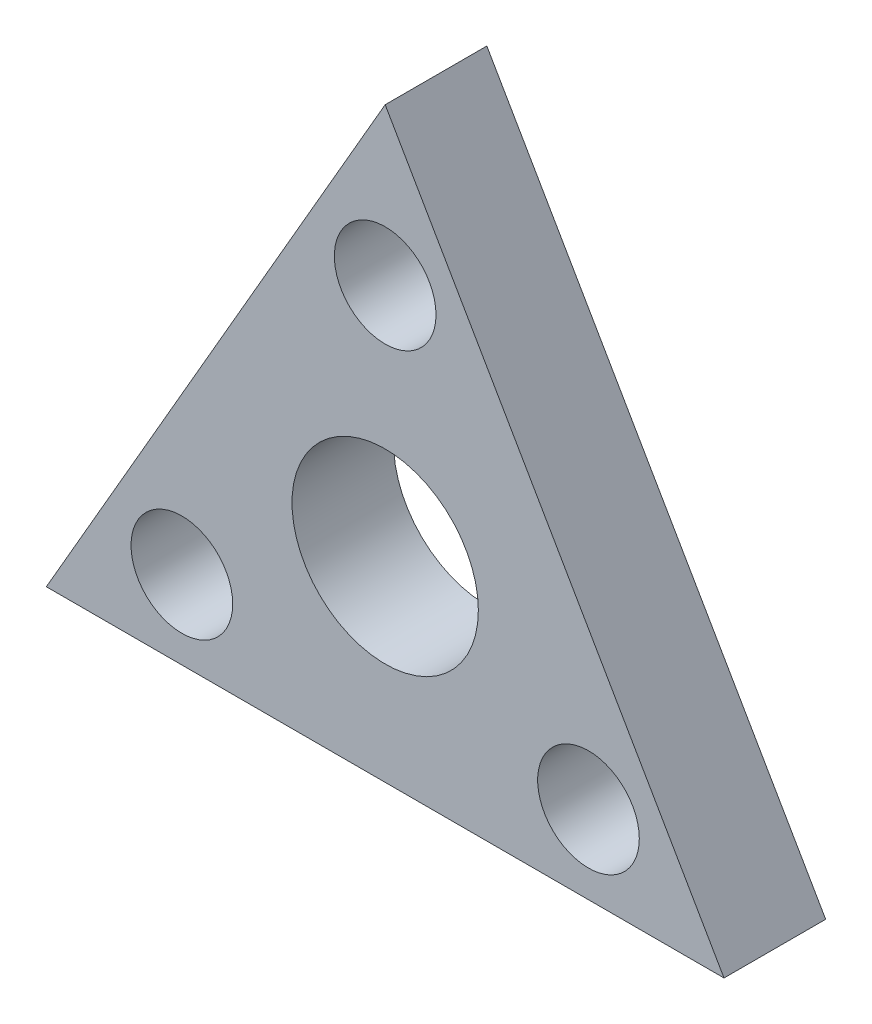
ISO-10303-21;
HEADER;
FILE_DESCRIPTION(('STEP AP214'),'2;1');
FILE_NAME('part.step','',(''),(''),'','','');
FILE_SCHEMA(('AUTOMOTIVE_DESIGN { 1 0 10303 214 1 1 1 1 }'));
ENDSEC;
DATA;
#1=APPLICATION_CONTEXT('core data for automotive mechanical design processes');
#2=APPLICATION_PROTOCOL_DEFINITION('international standard','automotive_design',2000,#1);
#3=PRODUCT_CONTEXT('',#1,'mechanical');
#4=PRODUCT('Part','Part','',(#3));
#5=PRODUCT_RELATED_PRODUCT_CATEGORY('part','',(#4));
#6=PRODUCT_DEFINITION_FORMATION('','',#4);
#7=PRODUCT_DEFINITION_CONTEXT('part definition',#1,'design');
#8=PRODUCT_DEFINITION('design','',#6,#7);
#9=PRODUCT_DEFINITION_SHAPE('','',#8);
#10=(LENGTH_UNIT() NAMED_UNIT(*) SI_UNIT(.MILLI.,.METRE.));
#11=(NAMED_UNIT(*) PLANE_ANGLE_UNIT() SI_UNIT($,.RADIAN.));
#12=(NAMED_UNIT(*) SI_UNIT($,.STERADIAN.) SOLID_ANGLE_UNIT());
#13=UNCERTAINTY_MEASURE_WITH_UNIT(LENGTH_MEASURE(1.E-05),#10,'distance_accuracy_value','');
#14=(GEOMETRIC_REPRESENTATION_CONTEXT(3) GLOBAL_UNCERTAINTY_ASSIGNED_CONTEXT((#13)) GLOBAL_UNIT_ASSIGNED_CONTEXT((#10,
#11,#12)) REPRESENTATION_CONTEXT('',''));
#15=CARTESIAN_POINT('',(0.,0.,0.));
#16=DIRECTION('',(0.,0.,1.));
#17=DIRECTION('',(1.,0.,0.));
#18=AXIS2_PLACEMENT_3D('',#15,#16,#17);
#19=CARTESIAN_POINT('',(0.,0.,3.));
#20=DIRECTION('',(0.,0.,1.));
#21=DIRECTION('',(1.,0.,0.));
#22=AXIS2_PLACEMENT_3D('',#19,#20,#21);
#23=PLANE('',#22);
#24=CARTESIAN_POINT('',(6.,-3.46410161513776,3.));
#25=DIRECTION('',(0.,0.,1.));
#26=DIRECTION('',(1.,0.,0.));
#27=AXIS2_PLACEMENT_3D('',#24,#25,#26);
#28=CIRCLE('',#27,1.5);
#29=CARTESIAN_POINT('',(7.5,-3.46410161513776,3.));
#30=VERTEX_POINT('',#29);
#31=EDGE_CURVE('E126',#30,#30,#28,.T.);
#32=ORIENTED_EDGE('',*,*,#31,.F.);
#33=EDGE_LOOP('',(#32));
#34=FACE_BOUND('',#33,.T.);
#35=CARTESIAN_POINT('',(0.,6.9282032302755,3.));
#36=DIRECTION('',(0.,0.,1.));
#37=DIRECTION('',(1.,0.,0.));
#38=AXIS2_PLACEMENT_3D('',#35,#36,#37);
#39=CIRCLE('',#38,1.5);
#40=CARTESIAN_POINT('',(1.5,6.9282032302755,3.));
#41=VERTEX_POINT('',#40);
#42=EDGE_CURVE('E92',#41,#41,#39,.T.);
#43=ORIENTED_EDGE('',*,*,#42,.F.);
#44=EDGE_LOOP('',(#43));
#45=FACE_BOUND('',#44,.T.);
#46=DIRECTION('',(-0.500000000000001,0.866025403784438,0.));
#47=VECTOR('',#46,1.);
#48=CARTESIAN_POINT('',(10.,-5.77350269189626,3.));
#49=LINE('',#48,#47);
#50=CARTESIAN_POINT('',(10.,-5.77350269189626,3.));
#51=VERTEX_POINT('',#50);
#52=CARTESIAN_POINT('',(0.,11.5470053837925,3.));
#53=VERTEX_POINT('',#52);
#54=EDGE_CURVE('E82',#51,#53,#49,.T.);
#55=ORIENTED_EDGE('',*,*,#54,.T.);
#56=DIRECTION('',(-0.5,-0.866025403784439,0.));
#57=VECTOR('',#56,1.);
#58=CARTESIAN_POINT('',(0.,11.5470053837925,3.));
#59=LINE('',#58,#57);
#60=CARTESIAN_POINT('',(-9.99999999999999,-5.77350269189626,3.));
#61=VERTEX_POINT('',#60);
#62=EDGE_CURVE('E78',#53,#61,#59,.T.);
#63=ORIENTED_EDGE('',*,*,#62,.T.);
#64=DIRECTION('',(1.,0.,0.));
#65=VECTOR('',#64,1.);
#66=CARTESIAN_POINT('',(-9.99999999999999,-5.77350269189626,3.));
#67=LINE('',#66,#65);
#68=EDGE_CURVE('E58',#61,#51,#67,.T.);
#69=ORIENTED_EDGE('',*,*,#68,.T.);
#70=EDGE_LOOP('',(#55,#63,#69));
#71=FACE_BOUND('',#70,.T.);
#72=CARTESIAN_POINT('',(-6.,-3.46410161513775,3.));
#73=DIRECTION('',(0.,0.,1.));
#74=DIRECTION('',(1.,0.,0.));
#75=AXIS2_PLACEMENT_3D('',#72,#73,#74);
#76=CIRCLE('',#75,1.5);
#77=CARTESIAN_POINT('',(-4.5,-3.46410161513775,3.));
#78=VERTEX_POINT('',#77);
#79=EDGE_CURVE('E130',#78,#78,#76,.T.);
#80=ORIENTED_EDGE('',*,*,#79,.F.);
#81=EDGE_LOOP('',(#80));
#82=FACE_BOUND('',#81,.T.);
#83=CARTESIAN_POINT('',(0.,0.,3.));
#84=DIRECTION('',(0.,0.,1.));
#85=DIRECTION('',(1.,0.,0.));
#86=AXIS2_PLACEMENT_3D('',#83,#84,#85);
#87=CIRCLE('',#86,2.75);
#88=CARTESIAN_POINT('',(2.75,0.,3.));
#89=VERTEX_POINT('',#88);
#90=EDGE_CURVE('E121',#89,#89,#87,.T.);
#91=ORIENTED_EDGE('',*,*,#90,.F.);
#92=EDGE_LOOP('',(#91));
#93=FACE_BOUND('',#92,.T.);
#94=ADVANCED_FACE('F41',(#34,#45,#71,#82,#93),#23,.T.);
#95=CARTESIAN_POINT('',(0.,0.,0.));
#96=DIRECTION('',(0.,0.,1.));
#97=DIRECTION('',(1.,0.,0.));
#98=AXIS2_PLACEMENT_3D('',#95,#96,#97);
#99=PLANE('',#98);
#100=DIRECTION('',(-0.500000000000001,0.866025403784438,0.));
#101=VECTOR('',#100,1.);
#102=CARTESIAN_POINT('',(10.,-5.77350269189626,0.));
#103=LINE('',#102,#101);
#104=CARTESIAN_POINT('',(10.,-5.77350269189626,0.));
#105=VERTEX_POINT('',#104);
#106=CARTESIAN_POINT('',(0.,11.5470053837925,0.));
#107=VERTEX_POINT('',#106);
#108=EDGE_CURVE('E89',#105,#107,#103,.T.);
#109=ORIENTED_EDGE('',*,*,#108,.F.);
#110=DIRECTION('',(1.,0.,0.));
#111=VECTOR('',#110,1.);
#112=CARTESIAN_POINT('',(-9.99999999999999,-5.77350269189626,0.));
#113=LINE('',#112,#111);
#114=CARTESIAN_POINT('',(-9.99999999999999,-5.77350269189626,0.));
#115=VERTEX_POINT('',#114);
#116=EDGE_CURVE('E75',#115,#105,#113,.T.);
#117=ORIENTED_EDGE('',*,*,#116,.F.);
#118=DIRECTION('',(-0.5,-0.866025403784439,0.));
#119=VECTOR('',#118,1.);
#120=CARTESIAN_POINT('',(0.,11.5470053837925,0.));
#121=LINE('',#120,#119);
#122=EDGE_CURVE('E70',#107,#115,#121,.T.);
#123=ORIENTED_EDGE('',*,*,#122,.F.);
#124=EDGE_LOOP('',(#109,#117,#123));
#125=FACE_BOUND('',#124,.T.);
#126=CARTESIAN_POINT('',(0.,6.9282032302755,0.));
#127=DIRECTION('',(0.,0.,1.));
#128=DIRECTION('',(1.,0.,0.));
#129=AXIS2_PLACEMENT_3D('',#126,#127,#128);
#130=CIRCLE('',#129,1.5);
#131=CARTESIAN_POINT('',(1.5,6.9282032302755,0.));
#132=VERTEX_POINT('',#131);
#133=EDGE_CURVE('E96',#132,#132,#130,.T.);
#134=ORIENTED_EDGE('',*,*,#133,.T.);
#135=EDGE_LOOP('',(#134));
#136=FACE_BOUND('',#135,.T.);
#137=CARTESIAN_POINT('',(-6.,-3.46410161513775,0.));
#138=DIRECTION('',(0.,0.,1.));
#139=DIRECTION('',(1.,0.,0.));
#140=AXIS2_PLACEMENT_3D('',#137,#138,#139);
#141=CIRCLE('',#140,1.5);
#142=CARTESIAN_POINT('',(-4.5,-3.46410161513775,0.));
#143=VERTEX_POINT('',#142);
#144=EDGE_CURVE('E112',#143,#143,#141,.T.);
#145=ORIENTED_EDGE('',*,*,#144,.T.);
#146=EDGE_LOOP('',(#145));
#147=FACE_BOUND('',#146,.T.);
#148=CARTESIAN_POINT('',(6.,-3.46410161513776,0.));
#149=DIRECTION('',(0.,0.,1.));
#150=DIRECTION('',(1.,0.,0.));
#151=AXIS2_PLACEMENT_3D('',#148,#149,#150);
#152=CIRCLE('',#151,1.5);
#153=CARTESIAN_POINT('',(7.5,-3.46410161513776,0.));
#154=VERTEX_POINT('',#153);
#155=EDGE_CURVE('E116',#154,#154,#152,.T.);
#156=ORIENTED_EDGE('',*,*,#155,.T.);
#157=EDGE_LOOP('',(#156));
#158=FACE_BOUND('',#157,.T.);
#159=CARTESIAN_POINT('',(0.,0.,0.));
#160=DIRECTION('',(0.,0.,1.));
#161=DIRECTION('',(1.,0.,0.));
#162=AXIS2_PLACEMENT_3D('',#159,#160,#161);
#163=CIRCLE('',#162,2.75);
#164=CARTESIAN_POINT('',(2.75,0.,0.));
#165=VERTEX_POINT('',#164);
#166=EDGE_CURVE('E119',#165,#165,#163,.T.);
#167=ORIENTED_EDGE('',*,*,#166,.T.);
#168=EDGE_LOOP('',(#167));
#169=FACE_BOUND('',#168,.T.);
#170=ADVANCED_FACE('F102',(#125,#136,#147,#158,#169),#99,.F.);
#171=CARTESIAN_POINT('',(10.,-5.77350269189626,3.));
#172=DIRECTION('',(-0.866025403784438,-0.5,0.));
#173=DIRECTION('',(0.500000000000001,-0.866025403784438,0.));
#174=AXIS2_PLACEMENT_3D('',#171,#172,#173);
#175=PLANE('',#174);
#176=ORIENTED_EDGE('',*,*,#108,.T.);
#177=DIRECTION('',(0.,0.,-1.));
#178=VECTOR('',#177,1.);
#179=CARTESIAN_POINT('',(0.,11.5470053837925,3.));
#180=LINE('',#179,#178);
#181=EDGE_CURVE('E11',#53,#107,#180,.T.);
#182=ORIENTED_EDGE('',*,*,#181,.F.);
#183=ORIENTED_EDGE('',*,*,#54,.F.);
#184=DIRECTION('',(0.,0.,-1.));
#185=VECTOR('',#184,1.);
#186=CARTESIAN_POINT('',(10.,-5.77350269189626,3.));
#187=LINE('',#186,#185);
#188=EDGE_CURVE('E90',#51,#105,#187,.T.);
#189=ORIENTED_EDGE('',*,*,#188,.T.);
#190=EDGE_LOOP('',(#176,#182,#183,#189));
#191=FACE_BOUND('',#190,.T.);
#192=ADVANCED_FACE('F43',(#191),#175,.F.);
#193=CARTESIAN_POINT('',(0.,11.5470053837925,3.));
#194=DIRECTION('',(0.866025403784439,-0.5,0.));
#195=DIRECTION('',(0.5,0.866025403784439,0.));
#196=AXIS2_PLACEMENT_3D('',#193,#194,#195);
#197=PLANE('',#196);
#198=ORIENTED_EDGE('',*,*,#122,.T.);
#199=DIRECTION('',(0.,0.,-1.));
#200=VECTOR('',#199,1.);
#201=CARTESIAN_POINT('',(-9.99999999999999,-5.77350269189626,3.));
#202=LINE('',#201,#200);
#203=EDGE_CURVE('E50',#61,#115,#202,.T.);
#204=ORIENTED_EDGE('',*,*,#203,.F.);
#205=ORIENTED_EDGE('',*,*,#62,.F.);
#206=ORIENTED_EDGE('',*,*,#181,.T.);
#207=EDGE_LOOP('',(#198,#204,#205,#206));
#208=FACE_BOUND('',#207,.T.);
#209=ADVANCED_FACE('F79',(#208),#197,.F.);
#210=CARTESIAN_POINT('',(-9.99999999999999,-5.77350269189626,3.));
#211=DIRECTION('',(0.,1.,0.));
#212=DIRECTION('',(-1.,0.,0.));
#213=AXIS2_PLACEMENT_3D('',#210,#211,#212);
#214=PLANE('',#213);
#215=ORIENTED_EDGE('',*,*,#116,.T.);
#216=ORIENTED_EDGE('',*,*,#188,.F.);
#217=ORIENTED_EDGE('',*,*,#68,.F.);
#218=ORIENTED_EDGE('',*,*,#203,.T.);
#219=EDGE_LOOP('',(#215,#216,#217,#218));
#220=FACE_BOUND('',#219,.T.);
#221=ADVANCED_FACE('F101',(#220),#214,.F.);
#222=CARTESIAN_POINT('',(0.,6.9282032302755,3.));
#223=DIRECTION('',(0.,0.,-1.));
#224=DIRECTION('',(-1.,0.,0.));
#225=AXIS2_PLACEMENT_3D('',#222,#223,#224);
#226=CYLINDRICAL_SURFACE('',#225,1.5);
#227=ORIENTED_EDGE('',*,*,#42,.T.);
#228=EDGE_LOOP('',(#227));
#229=FACE_BOUND('',#228,.T.);
#230=ORIENTED_EDGE('',*,*,#133,.F.);
#231=EDGE_LOOP('',(#230));
#232=FACE_BOUND('',#231,.T.);
#233=ADVANCED_FACE('F156',(#229,#232),#226,.F.);
#234=CARTESIAN_POINT('',(-6.,-3.46410161513775,3.));
#235=DIRECTION('',(0.,0.,-1.));
#236=DIRECTION('',(-1.,0.,0.));
#237=AXIS2_PLACEMENT_3D('',#234,#235,#236);
#238=CYLINDRICAL_SURFACE('',#237,1.5);
#239=ORIENTED_EDGE('',*,*,#79,.T.);
#240=EDGE_LOOP('',(#239));
#241=FACE_BOUND('',#240,.T.);
#242=ORIENTED_EDGE('',*,*,#144,.F.);
#243=EDGE_LOOP('',(#242));
#244=FACE_BOUND('',#243,.T.);
#245=ADVANCED_FACE('F136',(#241,#244),#238,.F.);
#246=CARTESIAN_POINT('',(6.,-3.46410161513776,3.));
#247=DIRECTION('',(0.,0.,-1.));
#248=DIRECTION('',(-1.,0.,0.));
#249=AXIS2_PLACEMENT_3D('',#246,#247,#248);
#250=CYLINDRICAL_SURFACE('',#249,1.5);
#251=ORIENTED_EDGE('',*,*,#31,.T.);
#252=EDGE_LOOP('',(#251));
#253=FACE_BOUND('',#252,.T.);
#254=ORIENTED_EDGE('',*,*,#155,.F.);
#255=EDGE_LOOP('',(#254));
#256=FACE_BOUND('',#255,.T.);
#257=ADVANCED_FACE('F146',(#253,#256),#250,.F.);
#258=CARTESIAN_POINT('',(0.,0.,3.));
#259=DIRECTION('',(0.,0.,-1.));
#260=DIRECTION('',(-1.,0.,0.));
#261=AXIS2_PLACEMENT_3D('',#258,#259,#260);
#262=CYLINDRICAL_SURFACE('',#261,2.75);
#263=ORIENTED_EDGE('',*,*,#90,.T.);
#264=EDGE_LOOP('',(#263));
#265=FACE_BOUND('',#264,.T.);
#266=ORIENTED_EDGE('',*,*,#166,.F.);
#267=EDGE_LOOP('',(#266));
#268=FACE_BOUND('',#267,.T.);
#269=ADVANCED_FACE('F144',(#265,#268),#262,.F.);
#270=CLOSED_SHELL('',(#94,#170,#192,#209,#221,#233,#245,#257,#269));
#271=MANIFOLD_SOLID_BREP('B2',#270);
#272=ADVANCED_BREP_SHAPE_REPRESENTATION('',(#18,#271),#14);
#273=SHAPE_DEFINITION_REPRESENTATION(#9,#272);
ENDSEC;
END-ISO-10303-21;
